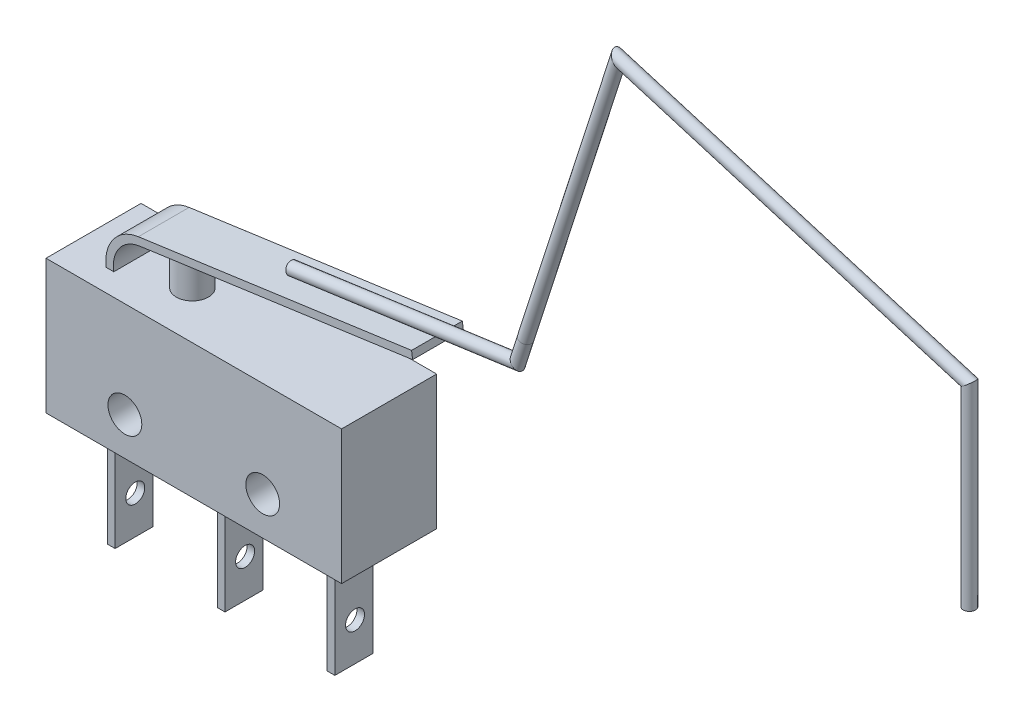
ISO-10303-21;
HEADER;
FILE_DESCRIPTION(('STEP AP214'),'2;1');
FILE_NAME('part.step','',(''),(''),'','','');
FILE_SCHEMA(('AUTOMOTIVE_DESIGN { 1 0 10303 214 1 1 1 1 }'));
ENDSEC;
DATA;
#1=APPLICATION_CONTEXT('core data for automotive mechanical design processes');
#2=APPLICATION_PROTOCOL_DEFINITION('international standard','automotive_design',2000,#1);
#3=PRODUCT_CONTEXT('',#1,'mechanical');
#4=PRODUCT('Part','Part','',(#3));
#5=PRODUCT_RELATED_PRODUCT_CATEGORY('part','',(#4));
#6=PRODUCT_DEFINITION_FORMATION('','',#4);
#7=PRODUCT_DEFINITION_CONTEXT('part definition',#1,'design');
#8=PRODUCT_DEFINITION('design','',#6,#7);
#9=PRODUCT_DEFINITION_SHAPE('','',#8);
#10=(LENGTH_UNIT() NAMED_UNIT(*) SI_UNIT(.MILLI.,.METRE.));
#11=(NAMED_UNIT(*) PLANE_ANGLE_UNIT() SI_UNIT($,.RADIAN.));
#12=(NAMED_UNIT(*) SI_UNIT($,.STERADIAN.) SOLID_ANGLE_UNIT());
#13=UNCERTAINTY_MEASURE_WITH_UNIT(LENGTH_MEASURE(1.E-05),#10,'distance_accuracy_value','');
#14=(GEOMETRIC_REPRESENTATION_CONTEXT(3) GLOBAL_UNCERTAINTY_ASSIGNED_CONTEXT((#13)) GLOBAL_UNIT_ASSIGNED_CONTEXT((#10,
#11,#12)) REPRESENTATION_CONTEXT('',''));
#15=CARTESIAN_POINT('',(0.,0.,0.));
#16=DIRECTION('',(0.,0.,1.));
#17=DIRECTION('',(1.,0.,0.));
#18=AXIS2_PLACEMENT_3D('',#15,#16,#17);
#19=CARTESIAN_POINT('',(3.37866316030526,8.95985000000002,0.));
#20=DIRECTION('',(0.99038572732491,0.138333333333328,0.));
#21=DIRECTION('',(-0.138333333333328,0.99038572732491,0.));
#22=AXIS2_PLACEMENT_3D('',#19,#20,#21);
#23=PLANE('',#22);
#24=CARTESIAN_POINT('',(3.37866316030526,8.95985000000002,0.));
#25=DIRECTION('',(0.99038572732491,0.138333333333328,0.));
#26=DIRECTION('',(-0.138333333333328,0.99038572732491,0.));
#27=AXIS2_PLACEMENT_3D('',#24,#25,#26);
#28=CIRCLE('',#27,0.4064);
#29=CARTESIAN_POINT('',(3.32244449363859,9.36234275958486,0.));
#30=VERTEX_POINT('',#29);
#31=EDGE_CURVE('E49',#30,#30,#28,.T.);
#32=ORIENTED_EDGE('',*,*,#31,.F.);
#33=EDGE_LOOP('',(#32));
#34=FACE_BOUND('',#33,.T.);
#35=ADVANCED_FACE('F46',(#34),#23,.F.);
#36=CARTESIAN_POINT('',(48.641,11.99515,0.));
#37=DIRECTION('',(0.,-1.,0.));
#38=DIRECTION('',(1.,0.,0.));
#39=AXIS2_PLACEMENT_3D('',#36,#37,#38);
#40=PLANE('',#39);
#41=CARTESIAN_POINT('',(48.641,11.99515,0.));
#42=DIRECTION('',(0.,-1.,0.));
#43=DIRECTION('',(1.,0.,0.));
#44=AXIS2_PLACEMENT_3D('',#41,#42,#43);
#45=CIRCLE('',#44,0.4064);
#46=CARTESIAN_POINT('',(49.0474,11.99515,0.));
#47=VERTEX_POINT('',#46);
#48=EDGE_CURVE('E53',#47,#47,#45,.T.);
#49=ORIENTED_EDGE('',*,*,#48,.T.);
#50=EDGE_LOOP('',(#49));
#51=FACE_BOUND('',#50,.T.);
#52=ADVANCED_FACE('F75',(#51),#40,.T.);
#53=CARTESIAN_POINT('',(18.8489928376309,11.1206871495927,0.));
#54=DIRECTION('',(-0.990385727324909,-0.138333333333333,0.));
#55=DIRECTION('',(0.138333333333333,-0.990385727324909,0.));
#56=AXIS2_PLACEMENT_3D('',#53,#54,#55);
#57=CYLINDRICAL_SURFACE('',#56,0.4064);
#58=CARTESIAN_POINT('',(18.4721416447368,11.06805,0.));
#59=DIRECTION('',(-0.765382775430344,-0.643575331312926,0.));
#60=DIRECTION('',(0.643575331312926,-0.765382775430344,0.));
#61=AXIS2_PLACEMENT_3D('',#58,#59,#60);
#62=ELLIPSE('',#61,0.479781587427207,0.4064);
#63=CARTESIAN_POINT('',(18.7809172388231,10.7008334370146,0.));
#64=VERTEX_POINT('',#63);
#65=EDGE_CURVE('E65',#64,#64,#62,.T.);
#66=ORIENTED_EDGE('',*,*,#65,.T.);
#67=EDGE_LOOP('',(#66));
#68=FACE_BOUND('',#67,.T.);
#69=ORIENTED_EDGE('',*,*,#31,.T.);
#70=EDGE_LOOP('',(#69));
#71=FACE_BOUND('',#70,.T.);
#72=ADVANCED_FACE('F72',(#68,#71),#57,.T.);
#73=CARTESIAN_POINT('',(25.3744486113482,32.5230736998964,0.));
#74=DIRECTION('',(-0.306252443401411,-0.951950335317271,0.));
#75=DIRECTION('',(0.951950335317271,-0.306252443401412,0.));
#76=AXIS2_PLACEMENT_3D('',#73,#74,#75);
#77=CYLINDRICAL_SURFACE('',#76,0.4064);
#78=CARTESIAN_POINT('',(25.2095,32.01035,0.));
#79=DIRECTION('',(-0.885294221613343,-0.465031333544337,0.));
#80=DIRECTION('',(-0.465031333544337,0.885294221613343,0.));
#81=AXIS2_PLACEMENT_3D('',#78,#79,#80);
#82=ELLIPSE('',#81,0.569338978579063,0.4064);
#83=CARTESIAN_POINT('',(24.9447395355526,32.5143825078753,0.));
#84=VERTEX_POINT('',#83);
#85=EDGE_CURVE('E58',#84,#84,#82,.T.);
#86=ORIENTED_EDGE('',*,*,#85,.T.);
#87=EDGE_LOOP('',(#86));
#88=FACE_BOUND('',#87,.T.);
#89=CARTESIAN_POINT('',(18.9992,12.70635,0.));
#90=DIRECTION('',(0.306252443401416,0.95195033531727,0.));
#91=DIRECTION('',(-0.95195033531727,0.306252443401416,0.));
#92=AXIS2_PLACEMENT_3D('',#89,#90,#91);
#93=CIRCLE('',#92,0.4064);
#94=CARTESIAN_POINT('',(18.612327383727,12.8308109929984,0.));
#95=VERTEX_POINT('',#94);
#96=EDGE_CURVE('E63',#95,#95,#93,.T.);
#97=ORIENTED_EDGE('',*,*,#96,.T.);
#98=EDGE_LOOP('',(#97));
#99=FACE_BOUND('',#98,.T.);
#100=ADVANCED_FACE('F93',(#88,#99),#77,.T.);
#101=CARTESIAN_POINT('',(18.9992,12.70635,0.));
#102=DIRECTION('',(-0.306252443401411,-0.951950335317272,0.));
#103=DIRECTION('',(0.951950335317272,-0.306252443401411,0.));
#104=AXIS2_PLACEMENT_3D('',#101,#102,#103);
#105=CYLINDRICAL_SURFACE('',#104,0.4064);
#106=ORIENTED_EDGE('',*,*,#96,.F.);
#107=EDGE_LOOP('',(#106));
#108=FACE_BOUND('',#107,.T.);
#109=ORIENTED_EDGE('',*,*,#65,.F.);
#110=EDGE_LOOP('',(#109));
#111=FACE_BOUND('',#110,.T.);
#112=ADVANCED_FACE('F88',(#108,#111),#105,.T.);
#113=CARTESIAN_POINT('',(49.0550259070579,24.8373056214541,0.));
#114=DIRECTION('',(-0.95761174015264,0.288062068175997,0.));
#115=DIRECTION('',(-0.288062068175997,-0.95761174015264,0.));
#116=AXIS2_PLACEMENT_3D('',#113,#114,#115);
#117=CYLINDRICAL_SURFACE('',#116,0.4064);
#118=CARTESIAN_POINT('',(48.641,24.96185,0.));
#119=DIRECTION('',(-0.59663134841542,0.802515441650812,0.));
#120=DIRECTION('',(0.802515441650812,0.59663134841542,0.));
#121=AXIS2_PLACEMENT_3D('',#118,#119,#120);
#122=ELLIPSE('',#121,0.506407701220073,0.4064);
#123=CARTESIAN_POINT('',(49.0474,25.2639887096269,0.));
#124=VERTEX_POINT('',#123);
#125=EDGE_CURVE('E11',#124,#124,#122,.T.);
#126=ORIENTED_EDGE('',*,*,#125,.T.);
#127=EDGE_LOOP('',(#126));
#128=FACE_BOUND('',#127,.T.);
#129=ORIENTED_EDGE('',*,*,#85,.F.);
#130=EDGE_LOOP('',(#129));
#131=FACE_BOUND('',#130,.T.);
#132=ADVANCED_FACE('F82',(#128,#131),#117,.T.);
#133=CARTESIAN_POINT('',(48.641,11.99515,0.));
#134=DIRECTION('',(0.,1.,0.));
#135=DIRECTION('',(-1.,0.,0.));
#136=AXIS2_PLACEMENT_3D('',#133,#134,#135);
#137=CYLINDRICAL_SURFACE('',#136,0.4064);
#138=ORIENTED_EDGE('',*,*,#48,.F.);
#139=EDGE_LOOP('',(#138));
#140=FACE_BOUND('',#139,.T.);
#141=ORIENTED_EDGE('',*,*,#125,.F.);
#142=EDGE_LOOP('',(#141));
#143=FACE_BOUND('',#142,.T.);
#144=ADVANCED_FACE('F80',(#140,#143),#137,.T.);
#145=CLOSED_SHELL('',(#35,#52,#72,#100,#112,#132,#144));
#146=MANIFOLD_SOLID_BREP('B2',#145);
#147=CARTESIAN_POINT('',(-9.87425,-4.47675,3.175));
#148=DIRECTION('',(0.,1.,0.));
#149=DIRECTION('',(0.,0.,1.));
#150=AXIS2_PLACEMENT_3D('',#147,#148,#149);
#151=PLANE('',#150);
#152=DIRECTION('',(-1.,0.,0.));
#153=VECTOR('',#152,1.);
#154=CARTESIAN_POINT('',(-0.253999999999999,-4.47675,-1.1938));
#155=LINE('',#154,#153);
#156=CARTESIAN_POINT('',(0.253999999999999,-4.47675,-1.1938));
#157=VERTEX_POINT('',#156);
#158=CARTESIAN_POINT('',(-0.253999999999999,-4.47675,-1.1938));
#159=VERTEX_POINT('',#158);
#160=EDGE_CURVE('E400',#157,#159,#155,.T.);
#161=ORIENTED_EDGE('',*,*,#160,.T.);
#162=DIRECTION('',(0.,0.,1.));
#163=VECTOR('',#162,1.);
#164=CARTESIAN_POINT('',(-0.253999999999999,-4.47675,-1.1938));
#165=LINE('',#164,#163);
#166=CARTESIAN_POINT('',(-0.253999999999999,-4.47675,1.3462));
#167=VERTEX_POINT('',#166);
#168=EDGE_CURVE('E413',#159,#167,#165,.T.);
#169=ORIENTED_EDGE('',*,*,#168,.T.);
#170=DIRECTION('',(-1.,0.,0.));
#171=VECTOR('',#170,1.);
#172=CARTESIAN_POINT('',(-0.253999999999999,-4.47675,1.3462));
#173=LINE('',#172,#171);
#174=CARTESIAN_POINT('',(0.254000000000003,-4.47675,1.3462));
#175=VERTEX_POINT('',#174);
#176=EDGE_CURVE('E395',#175,#167,#173,.T.);
#177=ORIENTED_EDGE('',*,*,#176,.F.);
#178=DIRECTION('',(0.,0.,1.));
#179=VECTOR('',#178,1.);
#180=CARTESIAN_POINT('',(0.253999999999999,-4.47675,-1.1938));
#181=LINE('',#180,#179);
#182=EDGE_CURVE('E417',#157,#175,#181,.T.);
#183=ORIENTED_EDGE('',*,*,#182,.F.);
#184=EDGE_LOOP('',(#161,#169,#177,#183));
#185=FACE_BOUND('',#184,.T.);
#186=DIRECTION('',(1.,0.,0.));
#187=VECTOR('',#186,1.);
#188=CARTESIAN_POINT('',(-9.87425,-4.47675,-3.175));
#189=LINE('',#188,#187);
#190=CARTESIAN_POINT('',(-9.87425,-4.47675,-3.175));
#191=VERTEX_POINT('',#190);
#192=CARTESIAN_POINT('',(9.87425,-4.47675,-3.175));
#193=VERTEX_POINT('',#192);
#194=EDGE_CURVE('E471',#191,#193,#189,.T.);
#195=ORIENTED_EDGE('',*,*,#194,.T.);
#196=DIRECTION('',(0.,0.,-1.));
#197=VECTOR('',#196,1.);
#198=CARTESIAN_POINT('',(9.87425,-4.47675,3.175));
#199=LINE('',#198,#197);
#200=CARTESIAN_POINT('',(9.87425,-4.47675,3.175));
#201=VERTEX_POINT('',#200);
#202=EDGE_CURVE('E477',#201,#193,#199,.T.);
#203=ORIENTED_EDGE('',*,*,#202,.F.);
#204=DIRECTION('',(1.,0.,0.));
#205=VECTOR('',#204,1.);
#206=CARTESIAN_POINT('',(-9.87425,-4.47675,3.175));
#207=LINE('',#206,#205);
#208=CARTESIAN_POINT('',(-9.87425,-4.47675,3.175));
#209=VERTEX_POINT('',#208);
#210=EDGE_CURVE('E475',#209,#201,#207,.T.);
#211=ORIENTED_EDGE('',*,*,#210,.F.);
#212=DIRECTION('',(0.,0.,-1.));
#213=VECTOR('',#212,1.);
#214=CARTESIAN_POINT('',(-9.87425,-4.47675,3.175));
#215=LINE('',#214,#213);
#216=EDGE_CURVE('E487',#209,#191,#215,.T.);
#217=ORIENTED_EDGE('',*,*,#216,.T.);
#218=EDGE_LOOP('',(#195,#203,#211,#217));
#219=FACE_BOUND('',#218,.T.);
#220=DIRECTION('',(-1.,0.,0.));
#221=VECTOR('',#220,1.);
#222=CARTESIAN_POINT('',(-7.5946,-4.47675,-1.1938));
#223=LINE('',#222,#221);
#224=CARTESIAN_POINT('',(-7.0866,-4.47675,-1.1938));
#225=VERTEX_POINT('',#224);
#226=CARTESIAN_POINT('',(-7.5946,-4.47675,-1.1938));
#227=VERTEX_POINT('',#226);
#228=EDGE_CURVE('E432',#225,#227,#223,.T.);
#229=ORIENTED_EDGE('',*,*,#228,.T.);
#230=DIRECTION('',(0.,0.,1.));
#231=VECTOR('',#230,1.);
#232=CARTESIAN_POINT('',(-7.5946,-4.47675,-1.1938));
#233=LINE('',#232,#231);
#234=CARTESIAN_POINT('',(-7.5946,-4.47675,1.3462));
#235=VERTEX_POINT('',#234);
#236=EDGE_CURVE('E445',#227,#235,#233,.T.);
#237=ORIENTED_EDGE('',*,*,#236,.T.);
#238=DIRECTION('',(-1.,0.,0.));
#239=VECTOR('',#238,1.);
#240=CARTESIAN_POINT('',(-7.5946,-4.47675,1.3462));
#241=LINE('',#240,#239);
#242=CARTESIAN_POINT('',(-7.0866,-4.47675,1.3462));
#243=VERTEX_POINT('',#242);
#244=EDGE_CURVE('E427',#243,#235,#241,.T.);
#245=ORIENTED_EDGE('',*,*,#244,.F.);
#246=DIRECTION('',(0.,0.,1.));
#247=VECTOR('',#246,1.);
#248=CARTESIAN_POINT('',(-7.0866,-4.47675,-1.1938));
#249=LINE('',#248,#247);
#250=EDGE_CURVE('E449',#225,#243,#249,.T.);
#251=ORIENTED_EDGE('',*,*,#250,.F.);
#252=EDGE_LOOP('',(#229,#237,#245,#251));
#253=FACE_BOUND('',#252,.T.);
#254=DIRECTION('',(-1.,0.,0.));
#255=VECTOR('',#254,1.);
#256=CARTESIAN_POINT('',(7.0866,-4.47675,-1.1938));
#257=LINE('',#256,#255);
#258=CARTESIAN_POINT('',(7.5946,-4.47675,-1.1938));
#259=VERTEX_POINT('',#258);
#260=CARTESIAN_POINT('',(7.0866,-4.47675,-1.1938));
#261=VERTEX_POINT('',#260);
#262=EDGE_CURVE('E368',#259,#261,#257,.T.);
#263=ORIENTED_EDGE('',*,*,#262,.T.);
#264=DIRECTION('',(0.,0.,1.));
#265=VECTOR('',#264,1.);
#266=CARTESIAN_POINT('',(7.0866,-4.47675,-1.1938));
#267=LINE('',#266,#265);
#268=CARTESIAN_POINT('',(7.0866,-4.47675,1.3462));
#269=VERTEX_POINT('',#268);
#270=EDGE_CURVE('E381',#261,#269,#267,.T.);
#271=ORIENTED_EDGE('',*,*,#270,.T.);
#272=DIRECTION('',(-1.,0.,0.));
#273=VECTOR('',#272,1.);
#274=CARTESIAN_POINT('',(7.0866,-4.47675,1.3462));
#275=LINE('',#274,#273);
#276=CARTESIAN_POINT('',(7.5946,-4.47675,1.3462));
#277=VERTEX_POINT('',#276);
#278=EDGE_CURVE('E363',#277,#269,#275,.T.);
#279=ORIENTED_EDGE('',*,*,#278,.F.);
#280=DIRECTION('',(0.,0.,1.));
#281=VECTOR('',#280,1.);
#282=CARTESIAN_POINT('',(7.5946,-4.47675,-1.1938));
#283=LINE('',#282,#281);
#284=EDGE_CURVE('E385',#259,#277,#283,.T.);
#285=ORIENTED_EDGE('',*,*,#284,.F.);
#286=EDGE_LOOP('',(#263,#271,#279,#285));
#287=FACE_BOUND('',#286,.T.);
#288=ADVANCED_FACE('F146',(#185,#219,#253,#287),#151,.F.);
#289=CARTESIAN_POINT('',(0.,0.,3.175));
#290=DIRECTION('',(0.,0.,-1.));
#291=DIRECTION('',(-1.,0.,0.));
#292=AXIS2_PLACEMENT_3D('',#289,#290,#291);
#293=PLANE('',#292);
#294=DIRECTION('',(0.,1.,0.));
#295=VECTOR('',#294,1.);
#296=CARTESIAN_POINT('',(9.87425,-4.47675,3.175));
#297=LINE('',#296,#295);
#298=CARTESIAN_POINT('',(9.87425,4.47675,3.175));
#299=VERTEX_POINT('',#298);
#300=EDGE_CURVE('E467',#201,#299,#297,.T.);
#301=ORIENTED_EDGE('',*,*,#300,.T.);
#302=DIRECTION('',(-1.,0.,0.));
#303=VECTOR('',#302,1.);
#304=CARTESIAN_POINT('',(-9.87425,4.47675,3.175));
#305=LINE('',#304,#303);
#306=CARTESIAN_POINT('',(-9.87425,4.47675,3.175));
#307=VERTEX_POINT('',#306);
#308=EDGE_CURVE('E470',#299,#307,#305,.T.);
#309=ORIENTED_EDGE('',*,*,#308,.T.);
#310=DIRECTION('',(0.,-1.,0.));
#311=VECTOR('',#310,1.);
#312=CARTESIAN_POINT('',(-9.87425,-4.47675,3.175));
#313=LINE('',#312,#311);
#314=EDGE_CURVE('E473',#307,#209,#313,.T.);
#315=ORIENTED_EDGE('',*,*,#314,.T.);
#316=ORIENTED_EDGE('',*,*,#210,.T.);
#317=EDGE_LOOP('',(#301,#309,#315,#316));
#318=FACE_BOUND('',#317,.T.);
#319=CARTESIAN_POINT('',(-4.60375,-1.93675,3.175));
#320=DIRECTION('',(0.,0.,1.));
#321=DIRECTION('',(1.,0.,0.));
#322=AXIS2_PLACEMENT_3D('',#319,#320,#321);
#323=CIRCLE('',#322,1.1303);
#324=CARTESIAN_POINT('',(-3.47345,-1.93675,3.175));
#325=VERTEX_POINT('',#324);
#326=EDGE_CURVE('E461',#325,#325,#323,.T.);
#327=ORIENTED_EDGE('',*,*,#326,.F.);
#328=EDGE_LOOP('',(#327));
#329=FACE_BOUND('',#328,.T.);
#330=CARTESIAN_POINT('',(4.60375,-1.93675,3.175));
#331=DIRECTION('',(0.,0.,1.));
#332=DIRECTION('',(1.,0.,0.));
#333=AXIS2_PLACEMENT_3D('',#330,#331,#332);
#334=CIRCLE('',#333,1.1303);
#335=CARTESIAN_POINT('',(5.73405,-1.93675,3.175));
#336=VERTEX_POINT('',#335);
#337=EDGE_CURVE('E455',#336,#336,#334,.T.);
#338=ORIENTED_EDGE('',*,*,#337,.F.);
#339=EDGE_LOOP('',(#338));
#340=FACE_BOUND('',#339,.T.);
#341=ADVANCED_FACE('F515',(#318,#329,#340),#293,.F.);
#342=CARTESIAN_POINT('',(0.,0.,-3.175));
#343=DIRECTION('',(0.,0.,-1.));
#344=DIRECTION('',(-1.,0.,0.));
#345=AXIS2_PLACEMENT_3D('',#342,#343,#344);
#346=PLANE('',#345);
#347=CARTESIAN_POINT('',(-4.60375,-1.93675,-3.175));
#348=DIRECTION('',(0.,0.,1.));
#349=DIRECTION('',(1.,0.,0.));
#350=AXIS2_PLACEMENT_3D('',#347,#348,#349);
#351=CIRCLE('',#350,1.1303);
#352=CARTESIAN_POINT('',(-3.47345,-1.93675,-3.175));
#353=VERTEX_POINT('',#352);
#354=EDGE_CURVE('E458',#353,#353,#351,.T.);
#355=ORIENTED_EDGE('',*,*,#354,.T.);
#356=EDGE_LOOP('',(#355));
#357=FACE_BOUND('',#356,.T.);
#358=DIRECTION('',(0.,1.,0.));
#359=VECTOR('',#358,1.);
#360=CARTESIAN_POINT('',(9.87425,-4.47675,-3.175));
#361=LINE('',#360,#359);
#362=CARTESIAN_POINT('',(9.87425,4.47675,-3.175));
#363=VERTEX_POINT('',#362);
#364=EDGE_CURVE('E464',#193,#363,#361,.T.);
#365=ORIENTED_EDGE('',*,*,#364,.F.);
#366=ORIENTED_EDGE('',*,*,#194,.F.);
#367=DIRECTION('',(0.,-1.,0.));
#368=VECTOR('',#367,1.);
#369=CARTESIAN_POINT('',(-9.87425,-4.47675,-3.175));
#370=LINE('',#369,#368);
#371=CARTESIAN_POINT('',(-9.87425,4.47675,-3.175));
#372=VERTEX_POINT('',#371);
#373=EDGE_CURVE('E482',#372,#191,#370,.T.);
#374=ORIENTED_EDGE('',*,*,#373,.F.);
#375=DIRECTION('',(-1.,0.,0.));
#376=VECTOR('',#375,1.);
#377=CARTESIAN_POINT('',(-9.87425,4.47675,-3.175));
#378=LINE('',#377,#376);
#379=EDGE_CURVE('E480',#363,#372,#378,.T.);
#380=ORIENTED_EDGE('',*,*,#379,.F.);
#381=EDGE_LOOP('',(#365,#366,#374,#380));
#382=FACE_BOUND('',#381,.T.);
#383=CARTESIAN_POINT('',(4.60375,-1.93675,-3.175));
#384=DIRECTION('',(0.,0.,1.));
#385=DIRECTION('',(1.,0.,0.));
#386=AXIS2_PLACEMENT_3D('',#383,#384,#385);
#387=CIRCLE('',#386,1.1303);
#388=CARTESIAN_POINT('',(5.73405,-1.93675,-3.175));
#389=VERTEX_POINT('',#388);
#390=EDGE_CURVE('E448',#389,#389,#387,.T.);
#391=ORIENTED_EDGE('',*,*,#390,.T.);
#392=EDGE_LOOP('',(#391));
#393=FACE_BOUND('',#392,.T.);
#394=ADVANCED_FACE('F521',(#357,#382,#393),#346,.T.);
#395=CARTESIAN_POINT('',(9.87425,-4.47675,3.175));
#396=DIRECTION('',(-1.,0.,0.));
#397=DIRECTION('',(0.,0.,1.));
#398=AXIS2_PLACEMENT_3D('',#395,#396,#397);
#399=PLANE('',#398);
#400=ORIENTED_EDGE('',*,*,#364,.T.);
#401=DIRECTION('',(0.,0.,-1.));
#402=VECTOR('',#401,1.);
#403=CARTESIAN_POINT('',(9.87425,4.47675,3.175));
#404=LINE('',#403,#402);
#405=EDGE_CURVE('E493',#299,#363,#404,.T.);
#406=ORIENTED_EDGE('',*,*,#405,.F.);
#407=ORIENTED_EDGE('',*,*,#300,.F.);
#408=ORIENTED_EDGE('',*,*,#202,.T.);
#409=EDGE_LOOP('',(#400,#406,#407,#408));
#410=FACE_BOUND('',#409,.T.);
#411=ADVANCED_FACE('F148',(#410),#399,.F.);
#412=CARTESIAN_POINT('',(-9.87425,4.47675,3.175));
#413=DIRECTION('',(0.,-1.,0.));
#414=DIRECTION('',(0.,0.,-1.));
#415=AXIS2_PLACEMENT_3D('',#412,#413,#414);
#416=PLANE('',#415);
#417=CARTESIAN_POINT('',(-3.27025,4.47675,0.));
#418=DIRECTION('',(0.,-1.,0.));
#419=DIRECTION('',(0.,0.,-1.));
#420=AXIS2_PLACEMENT_3D('',#417,#418,#419);
#421=CIRCLE('',#420,1.07315);
#422=CARTESIAN_POINT('',(-3.27025,4.47675,-1.07315));
#423=VERTEX_POINT('',#422);
#424=EDGE_CURVE('E44',#423,#423,#421,.F.);
#425=ORIENTED_EDGE('',*,*,#424,.F.);
#426=EDGE_LOOP('',(#425));
#427=FACE_BOUND('',#426,.T.);
#428=DIRECTION('',(0.,0.,-1.));
#429=VECTOR('',#428,1.);
#430=CARTESIAN_POINT('',(-6.82625,4.47675,1.69545));
#431=LINE('',#430,#429);
#432=CARTESIAN_POINT('',(-6.82625,4.47675,1.69545));
#433=VERTEX_POINT('',#432);
#434=CARTESIAN_POINT('',(-6.82625,4.47675,-1.69545));
#435=VERTEX_POINT('',#434);
#436=EDGE_CURVE('E166',#433,#435,#431,.T.);
#437=ORIENTED_EDGE('',*,*,#436,.F.);
#438=DIRECTION('',(1.,0.,0.));
#439=VECTOR('',#438,1.);
#440=CARTESIAN_POINT('',(-7.33425,4.47675,1.69545));
#441=LINE('',#440,#439);
#442=CARTESIAN_POINT('',(-7.33425,4.47675,1.69545));
#443=VERTEX_POINT('',#442);
#444=EDGE_CURVE('E161',#443,#433,#441,.T.);
#445=ORIENTED_EDGE('',*,*,#444,.F.);
#446=DIRECTION('',(0.,0.,-1.));
#447=VECTOR('',#446,1.);
#448=CARTESIAN_POINT('',(-7.33425,4.47675,1.69545));
#449=LINE('',#448,#447);
#450=CARTESIAN_POINT('',(-7.33425,4.47675,-1.69545));
#451=VERTEX_POINT('',#450);
#452=EDGE_CURVE('E340',#443,#451,#449,.T.);
#453=ORIENTED_EDGE('',*,*,#452,.T.);
#454=DIRECTION('',(1.,0.,0.));
#455=VECTOR('',#454,1.);
#456=CARTESIAN_POINT('',(-7.33425,4.47675,-1.69545));
#457=LINE('',#456,#455);
#458=EDGE_CURVE('E323',#451,#435,#457,.T.);
#459=ORIENTED_EDGE('',*,*,#458,.T.);
#460=EDGE_LOOP('',(#437,#445,#453,#459));
#461=FACE_BOUND('',#460,.T.);
#462=ORIENTED_EDGE('',*,*,#379,.T.);
#463=DIRECTION('',(0.,0.,-1.));
#464=VECTOR('',#463,1.);
#465=CARTESIAN_POINT('',(-9.87425,4.47675,3.175));
#466=LINE('',#465,#464);
#467=EDGE_CURVE('E490',#307,#372,#466,.T.);
#468=ORIENTED_EDGE('',*,*,#467,.F.);
#469=ORIENTED_EDGE('',*,*,#308,.F.);
#470=ORIENTED_EDGE('',*,*,#405,.T.);
#471=EDGE_LOOP('',(#462,#468,#469,#470));
#472=FACE_BOUND('',#471,.T.);
#473=ADVANCED_FACE('F530',(#427,#461,#472),#416,.F.);
#474=CARTESIAN_POINT('',(-9.87425,-4.47675,3.175));
#475=DIRECTION('',(1.,0.,0.));
#476=DIRECTION('',(0.,0.,-1.));
#477=AXIS2_PLACEMENT_3D('',#474,#475,#476);
#478=PLANE('',#477);
#479=ORIENTED_EDGE('',*,*,#373,.T.);
#480=ORIENTED_EDGE('',*,*,#216,.F.);
#481=ORIENTED_EDGE('',*,*,#314,.F.);
#482=ORIENTED_EDGE('',*,*,#467,.T.);
#483=EDGE_LOOP('',(#479,#480,#481,#482));
#484=FACE_BOUND('',#483,.T.);
#485=ADVANCED_FACE('F527',(#484),#478,.F.);
#486=CARTESIAN_POINT('',(-4.60375,-1.93675,3.175));
#487=DIRECTION('',(0.,0.,-1.));
#488=DIRECTION('',(-1.,0.,0.));
#489=AXIS2_PLACEMENT_3D('',#486,#487,#488);
#490=CYLINDRICAL_SURFACE('',#489,1.1303);
#491=ORIENTED_EDGE('',*,*,#326,.T.);
#492=EDGE_LOOP('',(#491));
#493=FACE_BOUND('',#492,.T.);
#494=ORIENTED_EDGE('',*,*,#354,.F.);
#495=EDGE_LOOP('',(#494));
#496=FACE_BOUND('',#495,.T.);
#497=ADVANCED_FACE('F529',(#493,#496),#490,.F.);
#498=CARTESIAN_POINT('',(4.60375,-1.93675,3.175));
#499=DIRECTION('',(0.,0.,-1.));
#500=DIRECTION('',(-1.,0.,0.));
#501=AXIS2_PLACEMENT_3D('',#498,#499,#500);
#502=CYLINDRICAL_SURFACE('',#501,1.1303);
#503=ORIENTED_EDGE('',*,*,#337,.T.);
#504=EDGE_LOOP('',(#503));
#505=FACE_BOUND('',#504,.T.);
#506=ORIENTED_EDGE('',*,*,#390,.F.);
#507=EDGE_LOOP('',(#506));
#508=FACE_BOUND('',#507,.T.);
#509=ADVANCED_FACE('F558',(#505,#508),#502,.F.);
#510=CARTESIAN_POINT('',(-7.5946,-4.47675,-1.1938));
#511=DIRECTION('',(-1.,0.,0.));
#512=DIRECTION('',(0.,-1.,0.));
#513=AXIS2_PLACEMENT_3D('',#510,#511,#512);
#514=PLANE('',#513);
#515=CARTESIAN_POINT('',(-7.5946,-9.30275,0.));
#516=DIRECTION('',(-1.,0.,0.));
#517=DIRECTION('',(0.,-1.,0.));
#518=AXIS2_PLACEMENT_3D('',#515,#516,#517);
#519=CIRCLE('',#518,0.635);
#520=CARTESIAN_POINT('',(-7.5946,-9.93775,0.));
#521=VERTEX_POINT('',#520);
#522=EDGE_CURVE('E342',#521,#521,#519,.T.);
#523=ORIENTED_EDGE('',*,*,#522,.F.);
#524=EDGE_LOOP('',(#523));
#525=FACE_BOUND('',#524,.T.);
#526=DIRECTION('',(0.,-1.,0.));
#527=VECTOR('',#526,1.);
#528=CARTESIAN_POINT('',(-7.5946,-4.47675,1.3462));
#529=LINE('',#528,#527);
#530=CARTESIAN_POINT('',(-7.5946,-11.84275,1.3462));
#531=VERTEX_POINT('',#530);
#532=EDGE_CURVE('E416',#235,#531,#529,.T.);
#533=ORIENTED_EDGE('',*,*,#532,.F.);
#534=ORIENTED_EDGE('',*,*,#236,.F.);
#535=DIRECTION('',(0.,-1.,0.));
#536=VECTOR('',#535,1.);
#537=CARTESIAN_POINT('',(-7.5946,-4.47675,-1.1938));
#538=LINE('',#537,#536);
#539=CARTESIAN_POINT('',(-7.5946,-11.84275,-1.1938));
#540=VERTEX_POINT('',#539);
#541=EDGE_CURVE('E423',#227,#540,#538,.T.);
#542=ORIENTED_EDGE('',*,*,#541,.T.);
#543=DIRECTION('',(0.,0.,1.));
#544=VECTOR('',#543,1.);
#545=CARTESIAN_POINT('',(-7.5946,-11.84275,-1.1938));
#546=LINE('',#545,#544);
#547=EDGE_CURVE('E435',#540,#531,#546,.T.);
#548=ORIENTED_EDGE('',*,*,#547,.T.);
#549=EDGE_LOOP('',(#533,#534,#542,#548));
#550=FACE_BOUND('',#549,.T.);
#551=ADVANCED_FACE('F561',(#525,#550),#514,.T.);
#552=CARTESIAN_POINT('',(-7.0866,-4.47675,-1.1938));
#553=DIRECTION('',(1.,0.,0.));
#554=DIRECTION('',(0.,1.,0.));
#555=AXIS2_PLACEMENT_3D('',#552,#553,#554);
#556=PLANE('',#555);
#557=CARTESIAN_POINT('',(-7.0866,-9.30275,0.));
#558=DIRECTION('',(1.,0.,0.));
#559=DIRECTION('',(0.,1.,0.));
#560=AXIS2_PLACEMENT_3D('',#557,#558,#559);
#561=CIRCLE('',#560,0.635);
#562=CARTESIAN_POINT('',(-7.0866,-8.66775,0.));
#563=VERTEX_POINT('',#562);
#564=EDGE_CURVE('E355',#563,#563,#561,.T.);
#565=ORIENTED_EDGE('',*,*,#564,.F.);
#566=EDGE_LOOP('',(#565));
#567=FACE_BOUND('',#566,.T.);
#568=DIRECTION('',(0.,1.,0.));
#569=VECTOR('',#568,1.);
#570=CARTESIAN_POINT('',(-7.0866,-4.47675,1.3462));
#571=LINE('',#570,#569);
#572=CARTESIAN_POINT('',(-7.0866,-11.84275,1.3462));
#573=VERTEX_POINT('',#572);
#574=EDGE_CURVE('E441',#573,#243,#571,.T.);
#575=ORIENTED_EDGE('',*,*,#574,.F.);
#576=DIRECTION('',(0.,0.,1.));
#577=VECTOR('',#576,1.);
#578=CARTESIAN_POINT('',(-7.0866,-11.84275,-1.1938));
#579=LINE('',#578,#577);
#580=CARTESIAN_POINT('',(-7.0866,-11.84275,-1.1938));
#581=VERTEX_POINT('',#580);
#582=EDGE_CURVE('E452',#581,#573,#579,.T.);
#583=ORIENTED_EDGE('',*,*,#582,.F.);
#584=DIRECTION('',(0.,1.,0.));
#585=VECTOR('',#584,1.);
#586=CARTESIAN_POINT('',(-7.0866,-4.47675,-1.1938));
#587=LINE('',#586,#585);
#588=EDGE_CURVE('E430',#581,#225,#587,.T.);
#589=ORIENTED_EDGE('',*,*,#588,.T.);
#590=ORIENTED_EDGE('',*,*,#250,.T.);
#591=EDGE_LOOP('',(#575,#583,#589,#590));
#592=FACE_BOUND('',#591,.T.);
#593=ADVANCED_FACE('F578',(#567,#592),#556,.T.);
#594=CARTESIAN_POINT('',(-7.5946,-11.84275,-1.1938));
#595=DIRECTION('',(0.,-1.,0.));
#596=DIRECTION('',(0.,0.,-1.));
#597=AXIS2_PLACEMENT_3D('',#594,#595,#596);
#598=PLANE('',#597);
#599=DIRECTION('',(1.,0.,0.));
#600=VECTOR('',#599,1.);
#601=CARTESIAN_POINT('',(-7.5946,-11.84275,1.3462));
#602=LINE('',#601,#600);
#603=EDGE_CURVE('E438',#531,#573,#602,.T.);
#604=ORIENTED_EDGE('',*,*,#603,.F.);
#605=ORIENTED_EDGE('',*,*,#547,.F.);
#606=DIRECTION('',(1.,0.,0.));
#607=VECTOR('',#606,1.);
#608=CARTESIAN_POINT('',(-7.5946,-11.84275,-1.1938));
#609=LINE('',#608,#607);
#610=EDGE_CURVE('E426',#540,#581,#609,.T.);
#611=ORIENTED_EDGE('',*,*,#610,.T.);
#612=ORIENTED_EDGE('',*,*,#582,.T.);
#613=EDGE_LOOP('',(#604,#605,#611,#612));
#614=FACE_BOUND('',#613,.T.);
#615=ADVANCED_FACE('F580',(#614),#598,.T.);
#616=CARTESIAN_POINT('',(0.,0.,-1.1938));
#617=DIRECTION('',(0.,0.,1.));
#618=DIRECTION('',(1.,0.,0.));
#619=AXIS2_PLACEMENT_3D('',#616,#617,#618);
#620=PLANE('',#619);
#621=ORIENTED_EDGE('',*,*,#541,.F.);
#622=ORIENTED_EDGE('',*,*,#228,.F.);
#623=ORIENTED_EDGE('',*,*,#588,.F.);
#624=ORIENTED_EDGE('',*,*,#610,.F.);
#625=EDGE_LOOP('',(#621,#622,#623,#624));
#626=FACE_BOUND('',#625,.T.);
#627=ADVANCED_FACE('F583',(#626),#620,.F.);
#628=CARTESIAN_POINT('',(0.,0.,1.3462));
#629=DIRECTION('',(0.,0.,1.));
#630=DIRECTION('',(1.,0.,0.));
#631=AXIS2_PLACEMENT_3D('',#628,#629,#630);
#632=PLANE('',#631);
#633=ORIENTED_EDGE('',*,*,#532,.T.);
#634=ORIENTED_EDGE('',*,*,#603,.T.);
#635=ORIENTED_EDGE('',*,*,#574,.T.);
#636=ORIENTED_EDGE('',*,*,#244,.T.);
#637=EDGE_LOOP('',(#633,#634,#635,#636));
#638=FACE_BOUND('',#637,.T.);
#639=ADVANCED_FACE('F588',(#638),#632,.T.);
#640=CARTESIAN_POINT('',(-0.253999999999999,-4.47675,-1.1938));
#641=DIRECTION('',(-1.,0.,0.));
#642=DIRECTION('',(0.,-1.,0.));
#643=AXIS2_PLACEMENT_3D('',#640,#641,#642);
#644=PLANE('',#643);
#645=CARTESIAN_POINT('',(-0.253999999999999,-9.30275,0.));
#646=DIRECTION('',(-1.,0.,0.));
#647=DIRECTION('',(0.,-1.,0.));
#648=AXIS2_PLACEMENT_3D('',#645,#646,#647);
#649=CIRCLE('',#648,0.635);
#650=CARTESIAN_POINT('',(-0.253999999999999,-9.93775,0.));
#651=VERTEX_POINT('',#650);
#652=EDGE_CURVE('E352',#651,#651,#649,.T.);
#653=ORIENTED_EDGE('',*,*,#652,.F.);
#654=EDGE_LOOP('',(#653));
#655=FACE_BOUND('',#654,.T.);
#656=DIRECTION('',(0.,-1.,0.));
#657=VECTOR('',#656,1.);
#658=CARTESIAN_POINT('',(-0.253999999999999,-4.47675,1.3462));
#659=LINE('',#658,#657);
#660=CARTESIAN_POINT('',(-0.253999999999998,-11.84275,1.3462));
#661=VERTEX_POINT('',#660);
#662=EDGE_CURVE('E384',#167,#661,#659,.T.);
#663=ORIENTED_EDGE('',*,*,#662,.F.);
#664=ORIENTED_EDGE('',*,*,#168,.F.);
#665=DIRECTION('',(0.,-1.,0.));
#666=VECTOR('',#665,1.);
#667=CARTESIAN_POINT('',(-0.253999999999999,-4.47675,-1.1938));
#668=LINE('',#667,#666);
#669=CARTESIAN_POINT('',(-0.253999999999998,-11.84275,-1.1938));
#670=VERTEX_POINT('',#669);
#671=EDGE_CURVE('E391',#159,#670,#668,.T.);
#672=ORIENTED_EDGE('',*,*,#671,.T.);
#673=DIRECTION('',(0.,0.,1.));
#674=VECTOR('',#673,1.);
#675=CARTESIAN_POINT('',(-0.253999999999998,-11.84275,-1.1938));
#676=LINE('',#675,#674);
#677=EDGE_CURVE('E403',#670,#661,#676,.T.);
#678=ORIENTED_EDGE('',*,*,#677,.T.);
#679=EDGE_LOOP('',(#663,#664,#672,#678));
#680=FACE_BOUND('',#679,.T.);
#681=ADVANCED_FACE('F591',(#655,#680),#644,.T.);
#682=CARTESIAN_POINT('',(0.253999999999999,-4.47675,-1.1938));
#683=DIRECTION('',(1.,0.,0.));
#684=DIRECTION('',(0.,1.,0.));
#685=AXIS2_PLACEMENT_3D('',#682,#683,#684);
#686=PLANE('',#685);
#687=CARTESIAN_POINT('',(0.254000000000001,-9.30275,0.));
#688=DIRECTION('',(1.,0.,0.));
#689=DIRECTION('',(0.,1.,0.));
#690=AXIS2_PLACEMENT_3D('',#687,#688,#689);
#691=CIRCLE('',#690,0.635);
#692=CARTESIAN_POINT('',(0.254000000000001,-8.66775,0.));
#693=VERTEX_POINT('',#692);
#694=EDGE_CURVE('E349',#693,#693,#691,.T.);
#695=ORIENTED_EDGE('',*,*,#694,.F.);
#696=EDGE_LOOP('',(#695));
#697=FACE_BOUND('',#696,.T.);
#698=DIRECTION('',(0.,1.,0.));
#699=VECTOR('',#698,1.);
#700=CARTESIAN_POINT('',(0.253999999999999,-4.47675,1.3462));
#701=LINE('',#700,#699);
#702=CARTESIAN_POINT('',(0.254000000000002,-11.84275,1.3462));
#703=VERTEX_POINT('',#702);
#704=EDGE_CURVE('E409',#703,#175,#701,.T.);
#705=ORIENTED_EDGE('',*,*,#704,.F.);
#706=DIRECTION('',(0.,0.,1.));
#707=VECTOR('',#706,1.);
#708=CARTESIAN_POINT('',(0.254000000000002,-11.84275,-1.1938));
#709=LINE('',#708,#707);
#710=CARTESIAN_POINT('',(0.254000000000002,-11.84275,-1.1938));
#711=VERTEX_POINT('',#710);
#712=EDGE_CURVE('E420',#711,#703,#709,.T.);
#713=ORIENTED_EDGE('',*,*,#712,.F.);
#714=DIRECTION('',(0.,1.,0.));
#715=VECTOR('',#714,1.);
#716=CARTESIAN_POINT('',(0.253999999999999,-4.47675,-1.1938));
#717=LINE('',#716,#715);
#718=EDGE_CURVE('E398',#711,#157,#717,.T.);
#719=ORIENTED_EDGE('',*,*,#718,.T.);
#720=ORIENTED_EDGE('',*,*,#182,.T.);
#721=EDGE_LOOP('',(#705,#713,#719,#720));
#722=FACE_BOUND('',#721,.T.);
#723=ADVANCED_FACE('F598',(#697,#722),#686,.T.);
#724=CARTESIAN_POINT('',(-0.253999999999998,-11.84275,-1.1938));
#725=DIRECTION('',(0.,-1.,0.));
#726=DIRECTION('',(0.,0.,-1.));
#727=AXIS2_PLACEMENT_3D('',#724,#725,#726);
#728=PLANE('',#727);
#729=DIRECTION('',(1.,0.,0.));
#730=VECTOR('',#729,1.);
#731=CARTESIAN_POINT('',(-0.253999999999998,-11.84275,1.3462));
#732=LINE('',#731,#730);
#733=EDGE_CURVE('E406',#661,#703,#732,.T.);
#734=ORIENTED_EDGE('',*,*,#733,.F.);
#735=ORIENTED_EDGE('',*,*,#677,.F.);
#736=DIRECTION('',(1.,0.,0.));
#737=VECTOR('',#736,1.);
#738=CARTESIAN_POINT('',(-0.253999999999998,-11.84275,-1.1938));
#739=LINE('',#738,#737);
#740=EDGE_CURVE('E394',#670,#711,#739,.T.);
#741=ORIENTED_EDGE('',*,*,#740,.T.);
#742=ORIENTED_EDGE('',*,*,#712,.T.);
#743=EDGE_LOOP('',(#734,#735,#741,#742));
#744=FACE_BOUND('',#743,.T.);
#745=ADVANCED_FACE('F600',(#744),#728,.T.);
#746=CARTESIAN_POINT('',(0.,0.,-1.1938));
#747=DIRECTION('',(0.,0.,1.));
#748=DIRECTION('',(1.,0.,0.));
#749=AXIS2_PLACEMENT_3D('',#746,#747,#748);
#750=PLANE('',#749);
#751=ORIENTED_EDGE('',*,*,#671,.F.);
#752=ORIENTED_EDGE('',*,*,#160,.F.);
#753=ORIENTED_EDGE('',*,*,#718,.F.);
#754=ORIENTED_EDGE('',*,*,#740,.F.);
#755=EDGE_LOOP('',(#751,#752,#753,#754));
#756=FACE_BOUND('',#755,.T.);
#757=ADVANCED_FACE('F603',(#756),#750,.F.);
#758=CARTESIAN_POINT('',(0.,0.,1.3462));
#759=DIRECTION('',(0.,0.,1.));
#760=DIRECTION('',(1.,0.,0.));
#761=AXIS2_PLACEMENT_3D('',#758,#759,#760);
#762=PLANE('',#761);
#763=ORIENTED_EDGE('',*,*,#662,.T.);
#764=ORIENTED_EDGE('',*,*,#733,.T.);
#765=ORIENTED_EDGE('',*,*,#704,.T.);
#766=ORIENTED_EDGE('',*,*,#176,.T.);
#767=EDGE_LOOP('',(#763,#764,#765,#766));
#768=FACE_BOUND('',#767,.T.);
#769=ADVANCED_FACE('F608',(#768),#762,.T.);
#770=CARTESIAN_POINT('',(7.0866,-4.47675,-1.1938));
#771=DIRECTION('',(-1.,0.,0.));
#772=DIRECTION('',(0.,-1.,0.));
#773=AXIS2_PLACEMENT_3D('',#770,#771,#772);
#774=PLANE('',#773);
#775=CARTESIAN_POINT('',(7.0866,-9.30275,0.));
#776=DIRECTION('',(-1.,0.,0.));
#777=DIRECTION('',(0.,-1.,0.));
#778=AXIS2_PLACEMENT_3D('',#775,#776,#777);
#779=CIRCLE('',#778,0.635);
#780=CARTESIAN_POINT('',(7.0866,-9.93775,0.));
#781=VERTEX_POINT('',#780);
#782=EDGE_CURVE('E346',#781,#781,#779,.T.);
#783=ORIENTED_EDGE('',*,*,#782,.F.);
#784=EDGE_LOOP('',(#783));
#785=FACE_BOUND('',#784,.T.);
#786=DIRECTION('',(0.,-1.,0.));
#787=VECTOR('',#786,1.);
#788=CARTESIAN_POINT('',(7.0866,-4.47675,1.3462));
#789=LINE('',#788,#787);
#790=CARTESIAN_POINT('',(7.0866,-11.84275,1.3462));
#791=VERTEX_POINT('',#790);
#792=EDGE_CURVE('E358',#269,#791,#789,.T.);
#793=ORIENTED_EDGE('',*,*,#792,.F.);
#794=ORIENTED_EDGE('',*,*,#270,.F.);
#795=DIRECTION('',(0.,-1.,0.));
#796=VECTOR('',#795,1.);
#797=CARTESIAN_POINT('',(7.0866,-4.47675,-1.1938));
#798=LINE('',#797,#796);
#799=CARTESIAN_POINT('',(7.0866,-11.84275,-1.1938));
#800=VERTEX_POINT('',#799);
#801=EDGE_CURVE('E359',#261,#800,#798,.T.);
#802=ORIENTED_EDGE('',*,*,#801,.T.);
#803=DIRECTION('',(0.,0.,1.));
#804=VECTOR('',#803,1.);
#805=CARTESIAN_POINT('',(7.0866,-11.84275,-1.1938));
#806=LINE('',#805,#804);
#807=EDGE_CURVE('E371',#800,#791,#806,.T.);
#808=ORIENTED_EDGE('',*,*,#807,.T.);
#809=EDGE_LOOP('',(#793,#794,#802,#808));
#810=FACE_BOUND('',#809,.T.);
#811=ADVANCED_FACE('F611',(#785,#810),#774,.T.);
#812=CARTESIAN_POINT('',(7.5946,-4.47675,-1.1938));
#813=DIRECTION('',(1.,0.,0.));
#814=DIRECTION('',(0.,1.,0.));
#815=AXIS2_PLACEMENT_3D('',#812,#813,#814);
#816=PLANE('',#815);
#817=CARTESIAN_POINT('',(7.5946,-9.30275,0.));
#818=DIRECTION('',(1.,0.,0.));
#819=DIRECTION('',(0.,1.,0.));
#820=AXIS2_PLACEMENT_3D('',#817,#818,#819);
#821=CIRCLE('',#820,0.635);
#822=CARTESIAN_POINT('',(7.5946,-8.66775,0.));
#823=VERTEX_POINT('',#822);
#824=EDGE_CURVE('E345',#823,#823,#821,.T.);
#825=ORIENTED_EDGE('',*,*,#824,.F.);
#826=EDGE_LOOP('',(#825));
#827=FACE_BOUND('',#826,.T.);
#828=DIRECTION('',(0.,1.,0.));
#829=VECTOR('',#828,1.);
#830=CARTESIAN_POINT('',(7.5946,-4.47675,1.3462));
#831=LINE('',#830,#829);
#832=CARTESIAN_POINT('',(7.5946,-11.84275,1.3462));
#833=VERTEX_POINT('',#832);
#834=EDGE_CURVE('E377',#833,#277,#831,.T.);
#835=ORIENTED_EDGE('',*,*,#834,.F.);
#836=DIRECTION('',(0.,0.,1.));
#837=VECTOR('',#836,1.);
#838=CARTESIAN_POINT('',(7.5946,-11.84275,-1.1938));
#839=LINE('',#838,#837);
#840=CARTESIAN_POINT('',(7.5946,-11.84275,-1.1938));
#841=VERTEX_POINT('',#840);
#842=EDGE_CURVE('E388',#841,#833,#839,.T.);
#843=ORIENTED_EDGE('',*,*,#842,.F.);
#844=DIRECTION('',(0.,1.,0.));
#845=VECTOR('',#844,1.);
#846=CARTESIAN_POINT('',(7.5946,-4.47675,-1.1938));
#847=LINE('',#846,#845);
#848=EDGE_CURVE('E366',#841,#259,#847,.T.);
#849=ORIENTED_EDGE('',*,*,#848,.T.);
#850=ORIENTED_EDGE('',*,*,#284,.T.);
#851=EDGE_LOOP('',(#835,#843,#849,#850));
#852=FACE_BOUND('',#851,.T.);
#853=ADVANCED_FACE('F618',(#827,#852),#816,.T.);
#854=CARTESIAN_POINT('',(7.0866,-11.84275,-1.1938));
#855=DIRECTION('',(0.,-1.,0.));
#856=DIRECTION('',(0.,0.,-1.));
#857=AXIS2_PLACEMENT_3D('',#854,#855,#856);
#858=PLANE('',#857);
#859=DIRECTION('',(1.,0.,0.));
#860=VECTOR('',#859,1.);
#861=CARTESIAN_POINT('',(7.0866,-11.84275,1.3462));
#862=LINE('',#861,#860);
#863=EDGE_CURVE('E374',#791,#833,#862,.T.);
#864=ORIENTED_EDGE('',*,*,#863,.F.);
#865=ORIENTED_EDGE('',*,*,#807,.F.);
#866=DIRECTION('',(1.,0.,0.));
#867=VECTOR('',#866,1.);
#868=CARTESIAN_POINT('',(7.0866,-11.84275,-1.1938));
#869=LINE('',#868,#867);
#870=EDGE_CURVE('E362',#800,#841,#869,.T.);
#871=ORIENTED_EDGE('',*,*,#870,.T.);
#872=ORIENTED_EDGE('',*,*,#842,.T.);
#873=EDGE_LOOP('',(#864,#865,#871,#872));
#874=FACE_BOUND('',#873,.T.);
#875=ADVANCED_FACE('F620',(#874),#858,.T.);
#876=CARTESIAN_POINT('',(0.,0.,-1.1938));
#877=DIRECTION('',(0.,0.,1.));
#878=DIRECTION('',(1.,0.,0.));
#879=AXIS2_PLACEMENT_3D('',#876,#877,#878);
#880=PLANE('',#879);
#881=ORIENTED_EDGE('',*,*,#801,.F.);
#882=ORIENTED_EDGE('',*,*,#262,.F.);
#883=ORIENTED_EDGE('',*,*,#848,.F.);
#884=ORIENTED_EDGE('',*,*,#870,.F.);
#885=EDGE_LOOP('',(#881,#882,#883,#884));
#886=FACE_BOUND('',#885,.T.);
#887=ADVANCED_FACE('F623',(#886),#880,.F.);
#888=CARTESIAN_POINT('',(0.,0.,1.3462));
#889=DIRECTION('',(0.,0.,1.));
#890=DIRECTION('',(1.,0.,0.));
#891=AXIS2_PLACEMENT_3D('',#888,#889,#890);
#892=PLANE('',#891);
#893=ORIENTED_EDGE('',*,*,#792,.T.);
#894=ORIENTED_EDGE('',*,*,#863,.T.);
#895=ORIENTED_EDGE('',*,*,#834,.T.);
#896=ORIENTED_EDGE('',*,*,#278,.T.);
#897=EDGE_LOOP('',(#893,#894,#895,#896));
#898=FACE_BOUND('',#897,.T.);
#899=ADVANCED_FACE('F628',(#898),#892,.T.);
#900=CARTESIAN_POINT('',(9.87425,-9.30275,0.));
#901=DIRECTION('',(-1.,0.,0.));
#902=DIRECTION('',(0.,-1.,0.));
#903=AXIS2_PLACEMENT_3D('',#900,#901,#902);
#904=CYLINDRICAL_SURFACE('',#903,0.635);
#905=ORIENTED_EDGE('',*,*,#782,.T.);
#906=EDGE_LOOP('',(#905));
#907=FACE_BOUND('',#906,.T.);
#908=ORIENTED_EDGE('',*,*,#824,.T.);
#909=EDGE_LOOP('',(#908));
#910=FACE_BOUND('',#909,.T.);
#911=ADVANCED_FACE('F631',(#907,#910),#904,.F.);
#912=ORIENTED_EDGE('',*,*,#652,.T.);
#913=EDGE_LOOP('',(#912));
#914=FACE_BOUND('',#913,.T.);
#915=ORIENTED_EDGE('',*,*,#694,.T.);
#916=EDGE_LOOP('',(#915));
#917=FACE_BOUND('',#916,.T.);
#918=ADVANCED_FACE('F638',(#914,#917),#904,.F.);
#919=ORIENTED_EDGE('',*,*,#564,.T.);
#920=EDGE_LOOP('',(#919));
#921=FACE_BOUND('',#920,.T.);
#922=ORIENTED_EDGE('',*,*,#522,.T.);
#923=EDGE_LOOP('',(#922));
#924=FACE_BOUND('',#923,.T.);
#925=ADVANCED_FACE('F640',(#921,#924),#904,.F.);
#926=CARTESIAN_POINT('',(-4.8322927438463,4.82621392860094,1.69545));
#927=DIRECTION('',(0.,0.,-1.));
#928=DIRECTION('',(-1.,0.,0.));
#929=AXIS2_PLACEMENT_3D('',#926,#927,#928);
#930=CYLINDRICAL_SURFACE('',#929,2.52624526699474);
#931=CARTESIAN_POINT('',(-4.8322927438463,4.82621392860094,-1.69545));
#932=DIRECTION('',(0.,0.,1.));
#933=DIRECTION('',(1.,0.,0.));
#934=AXIS2_PLACEMENT_3D('',#931,#932,#933);
#935=CIRCLE('',#934,2.52624526699474);
#936=CARTESIAN_POINT('',(-5.18175667244724,7.32817118475463,-1.69545));
#937=VERTEX_POINT('',#936);
#938=EDGE_CURVE('E320',#937,#451,#935,.T.);
#939=ORIENTED_EDGE('',*,*,#938,.T.);
#940=ORIENTED_EDGE('',*,*,#452,.F.);
#941=CARTESIAN_POINT('',(-4.8322927438463,4.82621392860094,1.69545));
#942=DIRECTION('',(0.,0.,1.));
#943=DIRECTION('',(1.,0.,0.));
#944=AXIS2_PLACEMENT_3D('',#941,#942,#943);
#945=CIRCLE('',#944,2.52624526699474);
#946=CARTESIAN_POINT('',(-5.18175667244724,7.32817118475463,1.69545));
#947=VERTEX_POINT('',#946);
#948=EDGE_CURVE('E332',#947,#443,#945,.T.);
#949=ORIENTED_EDGE('',*,*,#948,.F.);
#950=DIRECTION('',(0.,0.,-1.));
#951=VECTOR('',#950,1.);
#952=CARTESIAN_POINT('',(-5.18175667244724,7.32817118475463,1.69545));
#953=LINE('',#952,#951);
#954=EDGE_CURVE('E319',#947,#937,#953,.T.);
#955=ORIENTED_EDGE('',*,*,#954,.T.);
#956=EDGE_LOOP('',(#939,#940,#949,#955));
#957=FACE_BOUND('',#956,.T.);
#958=ADVANCED_FACE('F512',(#957),#930,.T.);
#959=CARTESIAN_POINT('',(-4.82688537251643,4.81700770615762,1.69545));
#960=DIRECTION('',(0.,0.,-1.));
#961=DIRECTION('',(-1.,0.,0.));
#962=AXIS2_PLACEMENT_3D('',#959,#960,#961);
#963=CYLINDRICAL_SURFACE('',#962,2.02811099800582);
#964=CARTESIAN_POINT('',(-4.82688537251643,4.81700770615762,-1.69545));
#965=DIRECTION('',(0.,0.,-1.));
#966=DIRECTION('',(1.,0.,0.));
#967=AXIS2_PLACEMENT_3D('',#964,#965,#966);
#968=CIRCLE('',#967,2.02811099800582);
#969=CARTESIAN_POINT('',(-5.10744072724057,6.82561989201326,-1.69545));
#970=VERTEX_POINT('',#969);
#971=EDGE_CURVE('E304',#435,#970,#968,.T.);
#972=ORIENTED_EDGE('',*,*,#971,.T.);
#973=DIRECTION('',(0.,0.,-1.));
#974=VECTOR('',#973,1.);
#975=CARTESIAN_POINT('',(-5.10744072724057,6.82561989201326,1.69545));
#976=LINE('',#975,#974);
#977=CARTESIAN_POINT('',(-5.10744072724057,6.82561989201326,1.69545));
#978=VERTEX_POINT('',#977);
#979=EDGE_CURVE('E301',#978,#970,#976,.T.);
#980=ORIENTED_EDGE('',*,*,#979,.F.);
#981=CARTESIAN_POINT('',(-4.82688537251643,4.81700770615762,1.69545));
#982=DIRECTION('',(0.,0.,-1.));
#983=DIRECTION('',(1.,0.,0.));
#984=AXIS2_PLACEMENT_3D('',#981,#982,#983);
#985=CIRCLE('',#984,2.02811099800582);
#986=EDGE_CURVE('E292',#433,#978,#985,.T.);
#987=ORIENTED_EDGE('',*,*,#986,.F.);
#988=ORIENTED_EDGE('',*,*,#436,.T.);
#989=EDGE_LOOP('',(#972,#980,#987,#988));
#990=FACE_BOUND('',#989,.T.);
#991=ADVANCED_FACE('F302',(#990),#963,.F.);
#992=CARTESIAN_POINT('',(13.1400923208259,9.37436630667264,1.69545));
#993=DIRECTION('',(-0.138333333333333,0.990385727324909,0.));
#994=DIRECTION('',(-0.990385727324909,-0.138333333333333,0.));
#995=AXIS2_PLACEMENT_3D('',#992,#993,#994);
#996=PLANE('',#995);
#997=CARTESIAN_POINT('',(-3.27025,7.08223174561371,0.));
#998=DIRECTION('',(-0.138333333333333,0.990385727324909,0.));
#999=DIRECTION('',(-0.990385727324909,-0.138333333333333,0.));
#1000=AXIS2_PLACEMENT_3D('',#997,#998,#999);
#1001=ELLIPSE('',#1000,1.08356771547854,1.07315);
#1002=CARTESIAN_POINT('',(-4.3434,6.93233821163918,0.));
#1003=VERTEX_POINT('',#1002);
#1004=EDGE_CURVE('E154',#1003,#1003,#1001,.F.);
#1005=ORIENTED_EDGE('',*,*,#1004,.F.);
#1006=EDGE_LOOP('',(#1005));
#1007=FACE_BOUND('',#1006,.T.);
#1008=DIRECTION('',(0.990385727324909,0.138333333333333,0.));
#1009=VECTOR('',#1008,1.);
#1010=CARTESIAN_POINT('',(13.1400923208259,9.37436630667264,-1.69545));
#1011=LINE('',#1010,#1009);
#1012=CARTESIAN_POINT('',(13.1400923208259,9.37436630667264,-1.69545));
#1013=VERTEX_POINT('',#1012);
#1014=EDGE_CURVE('E326',#970,#1013,#1011,.T.);
#1015=ORIENTED_EDGE('',*,*,#1014,.T.);
#1016=DIRECTION('',(0.,0.,-1.));
#1017=VECTOR('',#1016,1.);
#1018=CARTESIAN_POINT('',(13.1400923208259,9.37436630667264,1.69545));
#1019=LINE('',#1018,#1017);
#1020=CARTESIAN_POINT('',(13.1400923208259,9.37436630667264,1.69545));
#1021=VERTEX_POINT('',#1020);
#1022=EDGE_CURVE('E307',#1021,#1013,#1019,.T.);
#1023=ORIENTED_EDGE('',*,*,#1022,.F.);
#1024=DIRECTION('',(0.990385727324909,0.138333333333333,0.));
#1025=VECTOR('',#1024,1.);
#1026=CARTESIAN_POINT('',(13.1400923208259,9.37436630667264,1.69545));
#1027=LINE('',#1026,#1025);
#1028=EDGE_CURVE('E296',#978,#1021,#1027,.T.);
#1029=ORIENTED_EDGE('',*,*,#1028,.F.);
#1030=ORIENTED_EDGE('',*,*,#979,.T.);
#1031=EDGE_LOOP('',(#1015,#1023,#1029,#1030));
#1032=FACE_BOUND('',#1031,.T.);
#1033=ADVANCED_FACE('F309',(#1007,#1032),#996,.F.);
#1034=CARTESIAN_POINT('',(13.0698189874925,9.8774822561537,1.69545));
#1035=DIRECTION('',(-0.990385727324909,-0.138333333333331,0.));
#1036=DIRECTION('',(0.138333333333331,-0.990385727324909,0.));
#1037=AXIS2_PLACEMENT_3D('',#1034,#1035,#1036);
#1038=PLANE('',#1037);
#1039=DIRECTION('',(-0.138333333333331,0.990385727324909,0.));
#1040=VECTOR('',#1039,1.);
#1041=CARTESIAN_POINT('',(13.0698189874925,9.8774822561537,-1.69545));
#1042=LINE('',#1041,#1040);
#1043=CARTESIAN_POINT('',(13.0698189874925,9.8774822561537,-1.69545));
#1044=VERTEX_POINT('',#1043);
#1045=EDGE_CURVE('E328',#1013,#1044,#1042,.T.);
#1046=ORIENTED_EDGE('',*,*,#1045,.T.);
#1047=DIRECTION('',(0.,0.,-1.));
#1048=VECTOR('',#1047,1.);
#1049=CARTESIAN_POINT('',(13.0698189874925,9.8774822561537,1.69545));
#1050=LINE('',#1049,#1048);
#1051=CARTESIAN_POINT('',(13.0698189874925,9.8774822561537,1.69545));
#1052=VERTEX_POINT('',#1051);
#1053=EDGE_CURVE('E335',#1052,#1044,#1050,.T.);
#1054=ORIENTED_EDGE('',*,*,#1053,.F.);
#1055=DIRECTION('',(-0.138333333333331,0.990385727324909,0.));
#1056=VECTOR('',#1055,1.);
#1057=CARTESIAN_POINT('',(13.0698189874925,9.8774822561537,1.69545));
#1058=LINE('',#1057,#1056);
#1059=EDGE_CURVE('E312',#1021,#1052,#1058,.T.);
#1060=ORIENTED_EDGE('',*,*,#1059,.F.);
#1061=ORIENTED_EDGE('',*,*,#1022,.T.);
#1062=EDGE_LOOP('',(#1046,#1054,#1060,#1061));
#1063=FACE_BOUND('',#1062,.T.);
#1064=ADVANCED_FACE('F503',(#1063),#1038,.F.);
#1065=CARTESIAN_POINT('',(-5.18175667244724,7.32817118475463,1.69545));
#1066=DIRECTION('',(0.138333333333333,-0.990385727324909,0.));
#1067=DIRECTION('',(0.990385727324909,0.138333333333333,0.));
#1068=AXIS2_PLACEMENT_3D('',#1065,#1066,#1067);
#1069=PLANE('',#1068);
#1070=DIRECTION('',(-0.990385727324909,-0.138333333333333,0.));
#1071=VECTOR('',#1070,1.);
#1072=CARTESIAN_POINT('',(-5.18175667244724,7.32817118475463,-1.69545));
#1073=LINE('',#1072,#1071);
#1074=EDGE_CURVE('E330',#1044,#937,#1073,.T.);
#1075=ORIENTED_EDGE('',*,*,#1074,.T.);
#1076=ORIENTED_EDGE('',*,*,#954,.F.);
#1077=DIRECTION('',(-0.990385727324909,-0.138333333333333,0.));
#1078=VECTOR('',#1077,1.);
#1079=CARTESIAN_POINT('',(-5.18175667244724,7.32817118475463,1.69545));
#1080=LINE('',#1079,#1078);
#1081=EDGE_CURVE('E314',#1052,#947,#1080,.T.);
#1082=ORIENTED_EDGE('',*,*,#1081,.F.);
#1083=ORIENTED_EDGE('',*,*,#1053,.T.);
#1084=EDGE_LOOP('',(#1075,#1076,#1082,#1083));
#1085=FACE_BOUND('',#1084,.T.);
#1086=ADVANCED_FACE('F509',(#1085),#1069,.F.);
#1087=CARTESIAN_POINT('',(-4.8322927438463,4.82621392860094,1.69545));
#1088=DIRECTION('',(0.,0.,1.));
#1089=DIRECTION('',(1.,0.,0.));
#1090=AXIS2_PLACEMENT_3D('',#1087,#1088,#1089);
#1091=PLANE('',#1090);
#1092=ORIENTED_EDGE('',*,*,#948,.T.);
#1093=ORIENTED_EDGE('',*,*,#444,.T.);
#1094=ORIENTED_EDGE('',*,*,#986,.T.);
#1095=ORIENTED_EDGE('',*,*,#1028,.T.);
#1096=ORIENTED_EDGE('',*,*,#1059,.T.);
#1097=ORIENTED_EDGE('',*,*,#1081,.T.);
#1098=EDGE_LOOP('',(#1092,#1093,#1094,#1095,#1096,#1097));
#1099=FACE_BOUND('',#1098,.T.);
#1100=ADVANCED_FACE('F294',(#1099),#1091,.T.);
#1101=CARTESIAN_POINT('',(-4.8322927438463,4.82621392860094,-1.69545));
#1102=DIRECTION('',(0.,0.,1.));
#1103=DIRECTION('',(1.,0.,0.));
#1104=AXIS2_PLACEMENT_3D('',#1101,#1102,#1103);
#1105=PLANE('',#1104);
#1106=ORIENTED_EDGE('',*,*,#938,.F.);
#1107=ORIENTED_EDGE('',*,*,#1074,.F.);
#1108=ORIENTED_EDGE('',*,*,#1045,.F.);
#1109=ORIENTED_EDGE('',*,*,#1014,.F.);
#1110=ORIENTED_EDGE('',*,*,#971,.F.);
#1111=ORIENTED_EDGE('',*,*,#458,.F.);
#1112=EDGE_LOOP('',(#1106,#1107,#1108,#1109,#1110,#1111));
#1113=FACE_BOUND('',#1112,.T.);
#1114=ADVANCED_FACE('F654',(#1113),#1105,.F.);
#1115=CARTESIAN_POINT('',(-3.27025,10.1322911890538,0.));
#1116=DIRECTION('',(0.,-1.,0.));
#1117=DIRECTION('',(0.,0.,-1.));
#1118=AXIS2_PLACEMENT_3D('',#1115,#1116,#1117);
#1119=CYLINDRICAL_SURFACE('',#1118,1.07315);
#1120=ORIENTED_EDGE('',*,*,#424,.T.);
#1121=EDGE_LOOP('',(#1120));
#1122=FACE_BOUND('',#1121,.T.);
#1123=ORIENTED_EDGE('',*,*,#1004,.T.);
#1124=EDGE_LOOP('',(#1123));
#1125=FACE_BOUND('',#1124,.T.);
#1126=ADVANCED_FACE('F500',(#1122,#1125),#1119,.T.);
#1127=CLOSED_SHELL('',(#288,#341,#394,#411,#473,#485,#497,#509,#551,#593,#615,#627,#639,#681,
#723,#745,#757,#769,#811,#853,#875,#887,#899,#911,#918,#925,#958,#991,#1033,#1064,#1086,#1100,
#1114,#1126));
#1128=MANIFOLD_SOLID_BREP('B6',#1127);
#1129=ADVANCED_BREP_SHAPE_REPRESENTATION('',(#18,#146,#1128),#14);
#1130=SHAPE_DEFINITION_REPRESENTATION(#9,#1129);
ENDSEC;
END-ISO-10303-21;
